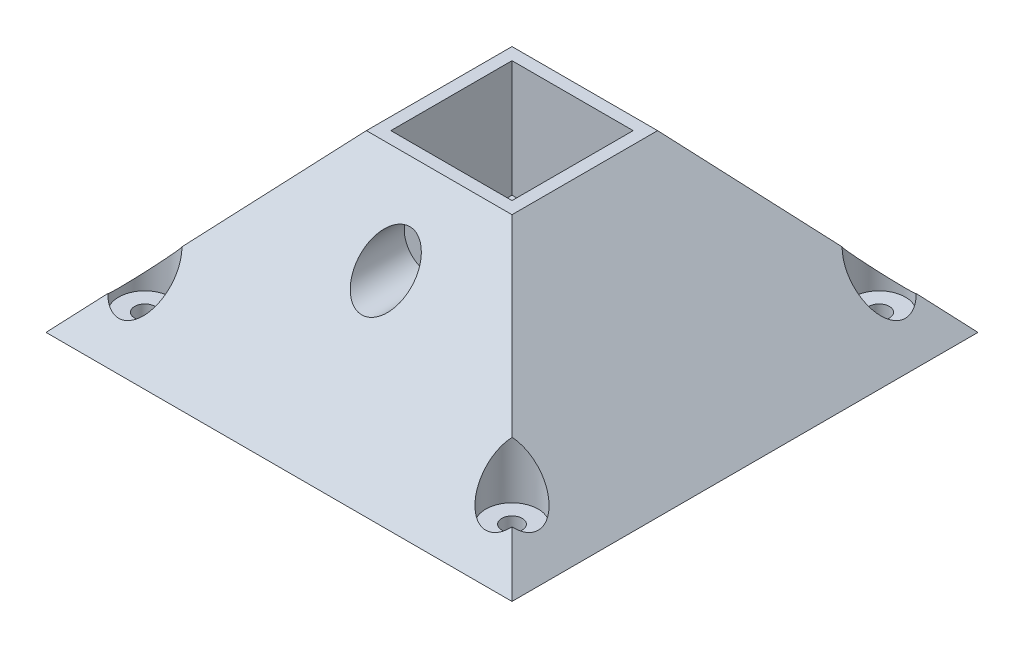
ISO-10303-21;
HEADER;
FILE_DESCRIPTION(('STEP AP214'),'2;1');
FILE_NAME('part.step','',(''),(''),'','','');
FILE_SCHEMA(('AUTOMOTIVE_DESIGN { 1 0 10303 214 1 1 1 1 }'));
ENDSEC;
DATA;
#1=APPLICATION_CONTEXT('core data for automotive mechanical design processes');
#2=APPLICATION_PROTOCOL_DEFINITION('international standard','automotive_design',2000,#1);
#3=PRODUCT_CONTEXT('',#1,'mechanical');
#4=PRODUCT('Part','Part','',(#3));
#5=PRODUCT_RELATED_PRODUCT_CATEGORY('part','',(#4));
#6=PRODUCT_DEFINITION_FORMATION('','',#4);
#7=PRODUCT_DEFINITION_CONTEXT('part definition',#1,'design');
#8=PRODUCT_DEFINITION('design','',#6,#7);
#9=PRODUCT_DEFINITION_SHAPE('','',#8);
#10=(LENGTH_UNIT() NAMED_UNIT(*) SI_UNIT(.MILLI.,.METRE.));
#11=(NAMED_UNIT(*) PLANE_ANGLE_UNIT() SI_UNIT($,.RADIAN.));
#12=(NAMED_UNIT(*) SI_UNIT($,.STERADIAN.) SOLID_ANGLE_UNIT());
#13=UNCERTAINTY_MEASURE_WITH_UNIT(LENGTH_MEASURE(1.E-05),#10,'distance_accuracy_value','');
#14=(GEOMETRIC_REPRESENTATION_CONTEXT(3) GLOBAL_UNCERTAINTY_ASSIGNED_CONTEXT((#13)) GLOBAL_UNIT_ASSIGNED_CONTEXT((#10,
#11,#12)) REPRESENTATION_CONTEXT('',''));
#15=CARTESIAN_POINT('',(0.,0.,0.));
#16=DIRECTION('',(0.,0.,1.));
#17=DIRECTION('',(1.,0.,0.));
#18=AXIS2_PLACEMENT_3D('',#15,#16,#17);
#19=CARTESIAN_POINT('',(31.5147186257611,30.0001,-31.5147186257618));
#20=DIRECTION('',(0.,-1.,0.));
#21=DIRECTION('',(0.,0.,-1.));
#22=AXIS2_PLACEMENT_3D('',#19,#20,#21);
#23=CYLINDRICAL_SURFACE('',#22,1.75);
#24=CARTESIAN_POINT('',(31.5147186257611,0.,-31.5147186257618));
#25=DIRECTION('',(0.,1.,0.));
#26=DIRECTION('',(-1.,0.,0.));
#27=AXIS2_PLACEMENT_3D('',#24,#25,#26);
#28=CIRCLE('',#27,1.75);
#29=CARTESIAN_POINT('',(29.7647186257611,0.,-31.5147186257617));
#30=VERTEX_POINT('',#29);
#31=EDGE_CURVE('E691',#30,#30,#28,.T.);
#32=ORIENTED_EDGE('',*,*,#31,.F.);
#33=EDGE_LOOP('',(#32));
#34=FACE_BOUND('',#33,.T.);
#35=CARTESIAN_POINT('',(31.5147186257611,3.,-31.5147186257618));
#36=DIRECTION('',(0.,1.,0.));
#37=DIRECTION('',(-1.,0.,0.));
#38=AXIS2_PLACEMENT_3D('',#35,#36,#37);
#39=CIRCLE('',#38,1.75);
#40=CARTESIAN_POINT('',(29.7647186257611,3.,-31.5147186257617));
#41=VERTEX_POINT('',#40);
#42=EDGE_CURVE('E680',#41,#41,#39,.T.);
#43=ORIENTED_EDGE('',*,*,#42,.T.);
#44=EDGE_LOOP('',(#43));
#45=FACE_BOUND('',#44,.T.);
#46=ADVANCED_FACE('F46',(#34,#45),#23,.F.);
#47=CARTESIAN_POINT('',(31.5147186257614,30.0001,31.5147186257614));
#48=DIRECTION('',(0.,-1.,0.));
#49=DIRECTION('',(0.,0.,-1.));
#50=AXIS2_PLACEMENT_3D('',#47,#48,#49);
#51=CYLINDRICAL_SURFACE('',#50,1.75);
#52=CARTESIAN_POINT('',(31.5147186257614,0.,31.5147186257614));
#53=DIRECTION('',(0.,1.,0.));
#54=DIRECTION('',(0.,0.,-1.));
#55=AXIS2_PLACEMENT_3D('',#52,#53,#54);
#56=CIRCLE('',#55,1.75);
#57=CARTESIAN_POINT('',(31.5147186257614,0.,29.7647186257614));
#58=VERTEX_POINT('',#57);
#59=EDGE_CURVE('E695',#58,#58,#56,.T.);
#60=ORIENTED_EDGE('',*,*,#59,.F.);
#61=EDGE_LOOP('',(#60));
#62=FACE_BOUND('',#61,.T.);
#63=CARTESIAN_POINT('',(31.5147186257614,3.,31.5147186257614));
#64=DIRECTION('',(0.,1.,0.));
#65=DIRECTION('',(0.,0.,-1.));
#66=AXIS2_PLACEMENT_3D('',#63,#64,#65);
#67=CIRCLE('',#66,1.75);
#68=CARTESIAN_POINT('',(31.5147186257614,3.,29.7647186257614));
#69=VERTEX_POINT('',#68);
#70=EDGE_CURVE('E672',#69,#69,#67,.T.);
#71=ORIENTED_EDGE('',*,*,#70,.T.);
#72=EDGE_LOOP('',(#71));
#73=FACE_BOUND('',#72,.T.);
#74=ADVANCED_FACE('F497',(#62,#73),#51,.F.);
#75=CARTESIAN_POINT('',(-31.5147186257613,30.0001,31.5147186257615));
#76=DIRECTION('',(0.,-1.,0.));
#77=DIRECTION('',(0.,0.,-1.));
#78=AXIS2_PLACEMENT_3D('',#75,#76,#77);
#79=CYLINDRICAL_SURFACE('',#78,1.75);
#80=CARTESIAN_POINT('',(-31.5147186257613,0.,31.5147186257615));
#81=DIRECTION('',(0.,1.,0.));
#82=DIRECTION('',(1.,0.,0.));
#83=AXIS2_PLACEMENT_3D('',#80,#81,#82);
#84=CIRCLE('',#83,1.75);
#85=CARTESIAN_POINT('',(-29.7647186257613,0.,31.5147186257615));
#86=VERTEX_POINT('',#85);
#87=EDGE_CURVE('E692',#86,#86,#84,.T.);
#88=ORIENTED_EDGE('',*,*,#87,.F.);
#89=EDGE_LOOP('',(#88));
#90=FACE_BOUND('',#89,.T.);
#91=CARTESIAN_POINT('',(-31.5147186257613,3.,31.5147186257615));
#92=DIRECTION('',(0.,1.,0.));
#93=DIRECTION('',(1.,0.,0.));
#94=AXIS2_PLACEMENT_3D('',#91,#92,#93);
#95=CIRCLE('',#94,1.75);
#96=CARTESIAN_POINT('',(-29.7647186257613,3.,31.5147186257615));
#97=VERTEX_POINT('',#96);
#98=EDGE_CURVE('E662',#97,#97,#95,.T.);
#99=ORIENTED_EDGE('',*,*,#98,.T.);
#100=EDGE_LOOP('',(#99));
#101=FACE_BOUND('',#100,.T.);
#102=ADVANCED_FACE('F504',(#90,#101),#79,.F.);
#103=CARTESIAN_POINT('',(-31.5147186257614,30.0001,-31.5147186257614));
#104=DIRECTION('',(0.,-1.,0.));
#105=DIRECTION('',(0.,0.,-1.));
#106=AXIS2_PLACEMENT_3D('',#103,#104,#105);
#107=CYLINDRICAL_SURFACE('',#106,1.75);
#108=CARTESIAN_POINT('',(-31.5147186257614,0.,-31.5147186257614));
#109=DIRECTION('',(0.,1.,0.));
#110=DIRECTION('',(0.,0.,1.));
#111=AXIS2_PLACEMENT_3D('',#108,#109,#110);
#112=CIRCLE('',#111,1.75);
#113=CARTESIAN_POINT('',(-31.5147186257614,0.,-29.7647186257614));
#114=VERTEX_POINT('',#113);
#115=EDGE_CURVE('E387',#114,#114,#112,.T.);
#116=ORIENTED_EDGE('',*,*,#115,.F.);
#117=EDGE_LOOP('',(#116));
#118=FACE_BOUND('',#117,.T.);
#119=CARTESIAN_POINT('',(-31.5147186257614,3.,-31.5147186257614));
#120=DIRECTION('',(0.,1.,0.));
#121=DIRECTION('',(0.,0.,1.));
#122=AXIS2_PLACEMENT_3D('',#119,#120,#121);
#123=CIRCLE('',#122,1.75);
#124=CARTESIAN_POINT('',(-31.5147186257614,3.,-29.7647186257614));
#125=VERTEX_POINT('',#124);
#126=EDGE_CURVE('E396',#125,#125,#123,.T.);
#127=ORIENTED_EDGE('',*,*,#126,.T.);
#128=EDGE_LOOP('',(#127));
#129=FACE_BOUND('',#128,.T.);
#130=ADVANCED_FACE('F491',(#118,#129),#107,.F.);
#131=CARTESIAN_POINT('',(0.,20.,40.0001));
#132=DIRECTION('',(0.,0.,-1.));
#133=DIRECTION('',(-1.,0.,0.));
#134=AXIS2_PLACEMENT_3D('',#131,#132,#133);
#135=CYLINDRICAL_SURFACE('',#134,1.75);
#136=CARTESIAN_POINT('',(0.,20.,10.4));
#137=DIRECTION('',(0.,0.,1.));
#138=DIRECTION('',(1.,0.,0.));
#139=AXIS2_PLACEMENT_3D('',#136,#137,#138);
#140=CIRCLE('',#139,1.75);
#141=CARTESIAN_POINT('',(1.75,20.,10.4));
#142=VERTEX_POINT('',#141);
#143=EDGE_CURVE('E314',#142,#142,#140,.F.);
#144=ORIENTED_EDGE('',*,*,#143,.T.);
#145=EDGE_LOOP('',(#144));
#146=FACE_BOUND('',#145,.T.);
#147=CARTESIAN_POINT('',(0.,20.,14.));
#148=DIRECTION('',(0.,0.,1.));
#149=DIRECTION('',(1.,0.,0.));
#150=AXIS2_PLACEMENT_3D('',#147,#148,#149);
#151=CIRCLE('',#150,1.75);
#152=CARTESIAN_POINT('',(1.75,20.,14.));
#153=VERTEX_POINT('',#152);
#154=EDGE_CURVE('E393',#153,#153,#151,.T.);
#155=ORIENTED_EDGE('',*,*,#154,.T.);
#156=EDGE_LOOP('',(#155));
#157=FACE_BOUND('',#156,.T.);
#158=ADVANCED_FACE('F484',(#146,#157),#135,.F.);
#159=CARTESIAN_POINT('',(0.,0.,0.));
#160=DIRECTION('',(0.,1.,0.));
#161=DIRECTION('',(0.,0.,1.));
#162=AXIS2_PLACEMENT_3D('',#159,#160,#161);
#163=PLANE('',#162);
#164=ORIENTED_EDGE('',*,*,#87,.T.);
#165=EDGE_LOOP('',(#164));
#166=FACE_BOUND('',#165,.T.);
#167=ORIENTED_EDGE('',*,*,#59,.T.);
#168=EDGE_LOOP('',(#167));
#169=FACE_BOUND('',#168,.T.);
#170=ORIENTED_EDGE('',*,*,#31,.T.);
#171=EDGE_LOOP('',(#170));
#172=FACE_BOUND('',#171,.T.);
#173=ORIENTED_EDGE('',*,*,#115,.T.);
#174=EDGE_LOOP('',(#173));
#175=FACE_BOUND('',#174,.T.);
#176=DIRECTION('',(0.,0.,1.));
#177=VECTOR('',#176,1.);
#178=CARTESIAN_POINT('',(-40.,0.,40.));
#179=LINE('',#178,#177);
#180=CARTESIAN_POINT('',(-40.,0.,-40.));
#181=VERTEX_POINT('',#180);
#182=CARTESIAN_POINT('',(-40.,0.,40.));
#183=VERTEX_POINT('',#182);
#184=EDGE_CURVE('E305',#181,#183,#179,.T.);
#185=ORIENTED_EDGE('',*,*,#184,.F.);
#186=DIRECTION('',(-1.,0.,0.));
#187=VECTOR('',#186,1.);
#188=CARTESIAN_POINT('',(40.,0.,-40.));
#189=LINE('',#188,#187);
#190=CARTESIAN_POINT('',(40.,0.,-40.));
#191=VERTEX_POINT('',#190);
#192=EDGE_CURVE('E298',#191,#181,#189,.T.);
#193=ORIENTED_EDGE('',*,*,#192,.F.);
#194=DIRECTION('',(0.,0.,-1.));
#195=VECTOR('',#194,1.);
#196=CARTESIAN_POINT('',(40.,0.,40.));
#197=LINE('',#196,#195);
#198=CARTESIAN_POINT('',(40.,0.,40.));
#199=VERTEX_POINT('',#198);
#200=EDGE_CURVE('E157',#199,#191,#197,.T.);
#201=ORIENTED_EDGE('',*,*,#200,.F.);
#202=DIRECTION('',(1.,0.,0.));
#203=VECTOR('',#202,1.);
#204=CARTESIAN_POINT('',(40.,0.,40.));
#205=LINE('',#204,#203);
#206=EDGE_CURVE('E279',#183,#199,#205,.T.);
#207=ORIENTED_EDGE('',*,*,#206,.F.);
#208=EDGE_LOOP('',(#185,#193,#201,#207));
#209=FACE_BOUND('',#208,.T.);
#210=ADVANCED_FACE('F48',(#166,#169,#172,#175,#209),#163,.F.);
#211=CARTESIAN_POINT('',(0.,30.,0.));
#212=DIRECTION('',(0.,1.,0.));
#213=DIRECTION('',(0.,0.,1.));
#214=AXIS2_PLACEMENT_3D('',#211,#212,#213);
#215=PLANE('',#214);
#216=DIRECTION('',(0.,0.,1.));
#217=VECTOR('',#216,1.);
#218=CARTESIAN_POINT('',(-10.4,30.,10.4));
#219=LINE('',#218,#217);
#220=CARTESIAN_POINT('',(-10.4,30.,-10.4));
#221=VERTEX_POINT('',#220);
#222=CARTESIAN_POINT('',(-10.4,30.,10.4));
#223=VERTEX_POINT('',#222);
#224=EDGE_CURVE('E323',#221,#223,#219,.T.);
#225=ORIENTED_EDGE('',*,*,#224,.F.);
#226=DIRECTION('',(-1.,0.,0.));
#227=VECTOR('',#226,1.);
#228=CARTESIAN_POINT('',(10.4,30.,-10.4));
#229=LINE('',#228,#227);
#230=CARTESIAN_POINT('',(10.4,30.,-10.4));
#231=VERTEX_POINT('',#230);
#232=EDGE_CURVE('E411',#231,#221,#229,.T.);
#233=ORIENTED_EDGE('',*,*,#232,.F.);
#234=DIRECTION('',(0.,0.,-1.));
#235=VECTOR('',#234,1.);
#236=CARTESIAN_POINT('',(10.4,30.,10.4));
#237=LINE('',#236,#235);
#238=CARTESIAN_POINT('',(10.4,30.,10.4));
#239=VERTEX_POINT('',#238);
#240=EDGE_CURVE('E430',#239,#231,#237,.T.);
#241=ORIENTED_EDGE('',*,*,#240,.F.);
#242=DIRECTION('',(1.,0.,0.));
#243=VECTOR('',#242,1.);
#244=CARTESIAN_POINT('',(10.4,30.,10.4));
#245=LINE('',#244,#243);
#246=EDGE_CURVE('E426',#223,#239,#245,.T.);
#247=ORIENTED_EDGE('',*,*,#246,.F.);
#248=EDGE_LOOP('',(#225,#233,#241,#247));
#249=FACE_BOUND('',#248,.T.);
#250=DIRECTION('',(0.,0.,1.));
#251=VECTOR('',#250,1.);
#252=CARTESIAN_POINT('',(-12.5,30.,12.5));
#253=LINE('',#252,#251);
#254=CARTESIAN_POINT('',(-12.5,30.,-12.5));
#255=VERTEX_POINT('',#254);
#256=CARTESIAN_POINT('',(-12.5,30.,12.5));
#257=VERTEX_POINT('',#256);
#258=EDGE_CURVE('E212',#255,#257,#253,.T.);
#259=ORIENTED_EDGE('',*,*,#258,.T.);
#260=DIRECTION('',(1.,0.,0.));
#261=VECTOR('',#260,1.);
#262=CARTESIAN_POINT('',(12.5,30.,12.5));
#263=LINE('',#262,#261);
#264=CARTESIAN_POINT('',(12.5,30.,12.5));
#265=VERTEX_POINT('',#264);
#266=EDGE_CURVE('E215',#257,#265,#263,.T.);
#267=ORIENTED_EDGE('',*,*,#266,.T.);
#268=DIRECTION('',(0.,0.,-1.));
#269=VECTOR('',#268,1.);
#270=CARTESIAN_POINT('',(12.5,30.,12.5));
#271=LINE('',#270,#269);
#272=CARTESIAN_POINT('',(12.5,30.,-12.5));
#273=VERTEX_POINT('',#272);
#274=EDGE_CURVE('E181',#265,#273,#271,.T.);
#275=ORIENTED_EDGE('',*,*,#274,.T.);
#276=DIRECTION('',(-1.,0.,0.));
#277=VECTOR('',#276,1.);
#278=CARTESIAN_POINT('',(12.5,30.,-12.5));
#279=LINE('',#278,#277);
#280=EDGE_CURVE('E256',#273,#255,#279,.T.);
#281=ORIENTED_EDGE('',*,*,#280,.T.);
#282=EDGE_LOOP('',(#259,#267,#275,#281));
#283=FACE_BOUND('',#282,.T.);
#284=ADVANCED_FACE('F230',(#249,#283),#215,.T.);
#285=CARTESIAN_POINT('',(-21.7358490566038,19.9245283018868,0.));
#286=DIRECTION('',(-0.737154140200741,0.675724628517346,0.));
#287=DIRECTION('',(-0.675724628517346,-0.737154140200741,0.));
#288=AXIS2_PLACEMENT_3D('',#285,#286,#287);
#289=PLANE('',#288);
#290=DIRECTION('',(-0.559885258415216,-0.610783918271145,0.559885258415216));
#291=VECTOR('',#290,1.);
#292=CARTESIAN_POINT('',(-12.5,30.,12.5));
#293=LINE('',#292,#291);
#294=CARTESIAN_POINT('',(-34.6966991411009,5.78541911879903,34.6966991411009));
#295=VERTEX_POINT('',#294);
#296=EDGE_CURVE('E168',#295,#183,#293,.T.);
#297=ORIENTED_EDGE('',*,*,#296,.F.);
#298=CARTESIAN_POINT('',(-31.5147186257613,9.25667059007857,31.5147186257615));
#299=DIRECTION('',(-0.737154140200741,0.675724628517346,0.));
#300=DIRECTION('',(-0.675724628517346,-0.737154140200741,0.));
#301=AXIS2_PLACEMENT_3D('',#298,#299,#300);
#302=ELLIPSE('',#301,6.65951751658625,4.5);
#303=CARTESIAN_POINT('',(-28.332738110422,12.7279220613579,28.332738110422));
#304=VERTEX_POINT('',#303);
#305=EDGE_CURVE('E62',#295,#304,#302,.F.);
#306=ORIENTED_EDGE('',*,*,#305,.T.);
#307=EDGE_CURVE('E161',#257,#304,#293,.T.);
#308=ORIENTED_EDGE('',*,*,#307,.F.);
#309=ORIENTED_EDGE('',*,*,#258,.F.);
#310=DIRECTION('',(-0.559885258415216,-0.610783918271145,-0.559885258415216));
#311=VECTOR('',#310,1.);
#312=CARTESIAN_POINT('',(-12.5,30.,-12.5));
#313=LINE('',#312,#311);
#314=CARTESIAN_POINT('',(-28.332738110422,12.7279220613579,-28.332738110422));
#315=VERTEX_POINT('',#314);
#316=EDGE_CURVE('E331',#255,#315,#313,.T.);
#317=ORIENTED_EDGE('',*,*,#316,.T.);
#318=CARTESIAN_POINT('',(-31.5147186257614,9.25667059007844,-31.5147186257614));
#319=DIRECTION('',(-0.737154140200741,0.675724628517346,0.));
#320=DIRECTION('',(-0.675724628517346,-0.737154140200741,0.));
#321=AXIS2_PLACEMENT_3D('',#318,#319,#320);
#322=ELLIPSE('',#321,6.65951751658625,4.5);
#323=CARTESIAN_POINT('',(-34.6966991411009,5.78541911879903,-34.6966991411009));
#324=VERTEX_POINT('',#323);
#325=EDGE_CURVE('E385',#315,#324,#322,.F.);
#326=ORIENTED_EDGE('',*,*,#325,.T.);
#327=EDGE_CURVE('E219',#324,#181,#313,.T.);
#328=ORIENTED_EDGE('',*,*,#327,.T.);
#329=ORIENTED_EDGE('',*,*,#184,.T.);
#330=EDGE_LOOP('',(#297,#306,#308,#309,#317,#326,#328,#329));
#331=FACE_BOUND('',#330,.T.);
#332=ADVANCED_FACE('F240',(#331),#289,.T.);
#333=CARTESIAN_POINT('',(0.,19.9245283018868,21.7358490566038));
#334=DIRECTION('',(0.,0.675724628517346,0.737154140200741));
#335=DIRECTION('',(0.,-0.737154140200741,0.675724628517346));
#336=AXIS2_PLACEMENT_3D('',#333,#334,#335);
#337=PLANE('',#336);
#338=CARTESIAN_POINT('',(0.,20.,21.6666666666667));
#339=DIRECTION('',(0.,0.675724628517346,0.737154140200741));
#340=DIRECTION('',(0.,0.737154140200741,-0.675724628517346));
#341=AXIS2_PLACEMENT_3D('',#338,#339,#340);
#342=ELLIPSE('',#341,6.10455772353739,4.5);
#343=CARTESIAN_POINT('',(0.,24.5,17.5416666666667));
#344=VERTEX_POINT('',#343);
#345=EDGE_CURVE('E324',#344,#344,#342,.F.);
#346=ORIENTED_EDGE('',*,*,#345,.T.);
#347=EDGE_LOOP('',(#346));
#348=FACE_BOUND('',#347,.T.);
#349=ORIENTED_EDGE('',*,*,#307,.T.);
#350=CARTESIAN_POINT('',(-31.5147186257613,9.25667059007832,31.5147186257615));
#351=DIRECTION('',(0.,0.675724628517346,0.737154140200741));
#352=DIRECTION('',(0.,-0.737154140200741,0.675724628517346));
#353=AXIS2_PLACEMENT_3D('',#350,#351,#352);
#354=ELLIPSE('',#353,6.65951751658625,4.5);
#355=EDGE_CURVE('E12',#304,#295,#354,.F.);
#356=ORIENTED_EDGE('',*,*,#355,.T.);
#357=ORIENTED_EDGE('',*,*,#296,.T.);
#358=ORIENTED_EDGE('',*,*,#206,.T.);
#359=DIRECTION('',(0.559885258415216,-0.610783918271145,0.559885258415216));
#360=VECTOR('',#359,1.);
#361=CARTESIAN_POINT('',(12.5,30.,12.5));
#362=LINE('',#361,#360);
#363=CARTESIAN_POINT('',(34.6966991411009,5.78541911879902,34.6966991411009));
#364=VERTEX_POINT('',#363);
#365=EDGE_CURVE('E165',#364,#199,#362,.T.);
#366=ORIENTED_EDGE('',*,*,#365,.F.);
#367=CARTESIAN_POINT('',(31.5147186257614,9.25667059007845,31.5147186257614));
#368=DIRECTION('',(0.,0.675724628517346,0.737154140200741));
#369=DIRECTION('',(0.,-0.737154140200741,0.675724628517346));
#370=AXIS2_PLACEMENT_3D('',#367,#368,#369);
#371=ELLIPSE('',#370,6.65951751658625,4.5);
#372=CARTESIAN_POINT('',(28.332738110422,12.7279220613579,28.332738110422));
#373=VERTEX_POINT('',#372);
#374=EDGE_CURVE('E151',#364,#373,#371,.F.);
#375=ORIENTED_EDGE('',*,*,#374,.T.);
#376=EDGE_CURVE('E363',#265,#373,#362,.T.);
#377=ORIENTED_EDGE('',*,*,#376,.F.);
#378=ORIENTED_EDGE('',*,*,#266,.F.);
#379=EDGE_LOOP('',(#349,#356,#357,#358,#366,#375,#377,#378));
#380=FACE_BOUND('',#379,.T.);
#381=ADVANCED_FACE('F377',(#348,#380),#337,.T.);
#382=CARTESIAN_POINT('',(0.,19.9245283018868,-21.7358490566038));
#383=DIRECTION('',(0.,0.675724628517346,-0.737154140200741));
#384=DIRECTION('',(0.,0.737154140200741,0.675724628517346));
#385=AXIS2_PLACEMENT_3D('',#382,#383,#384);
#386=PLANE('',#385);
#387=DIRECTION('',(0.559885258415216,-0.610783918271145,-0.559885258415216));
#388=VECTOR('',#387,1.);
#389=CARTESIAN_POINT('',(12.5,30.,-12.5));
#390=LINE('',#389,#388);
#391=CARTESIAN_POINT('',(28.332738110422,12.7279220613579,-28.332738110422));
#392=VERTEX_POINT('',#391);
#393=EDGE_CURVE('E149',#273,#392,#390,.T.);
#394=ORIENTED_EDGE('',*,*,#393,.T.);
#395=CARTESIAN_POINT('',(31.5147186257611,9.25667059007809,-31.5147186257618));
#396=DIRECTION('',(0.,0.675724628517346,-0.737154140200741));
#397=DIRECTION('',(0.,-0.737154140200741,-0.675724628517346));
#398=AXIS2_PLACEMENT_3D('',#395,#396,#397);
#399=ELLIPSE('',#398,6.65951751658625,4.5);
#400=CARTESIAN_POINT('',(34.6966991411009,5.78541911879903,-34.6966991411009));
#401=VERTEX_POINT('',#400);
#402=EDGE_CURVE('E68',#392,#401,#399,.F.);
#403=ORIENTED_EDGE('',*,*,#402,.T.);
#404=EDGE_CURVE('E146',#401,#191,#390,.T.);
#405=ORIENTED_EDGE('',*,*,#404,.T.);
#406=ORIENTED_EDGE('',*,*,#192,.T.);
#407=ORIENTED_EDGE('',*,*,#327,.F.);
#408=CARTESIAN_POINT('',(-31.5147186257614,9.25667059007846,-31.5147186257614));
#409=DIRECTION('',(0.,0.675724628517346,-0.737154140200741));
#410=DIRECTION('',(0.,-0.737154140200741,-0.675724628517346));
#411=AXIS2_PLACEMENT_3D('',#408,#409,#410);
#412=ELLIPSE('',#411,6.65951751658625,4.5);
#413=EDGE_CURVE('E141',#324,#315,#412,.F.);
#414=ORIENTED_EDGE('',*,*,#413,.T.);
#415=ORIENTED_EDGE('',*,*,#316,.F.);
#416=ORIENTED_EDGE('',*,*,#280,.F.);
#417=EDGE_LOOP('',(#394,#403,#405,#406,#407,#414,#415,#416));
#418=FACE_BOUND('',#417,.T.);
#419=ADVANCED_FACE('F144',(#418),#386,.T.);
#420=CARTESIAN_POINT('',(21.7358490566038,19.9245283018868,0.));
#421=DIRECTION('',(0.737154140200741,0.675724628517346,0.));
#422=DIRECTION('',(-0.675724628517346,0.737154140200741,0.));
#423=AXIS2_PLACEMENT_3D('',#420,#421,#422);
#424=PLANE('',#423);
#425=ORIENTED_EDGE('',*,*,#376,.T.);
#426=CARTESIAN_POINT('',(31.5147186257614,9.25667059007844,31.5147186257614));
#427=DIRECTION('',(0.737154140200741,0.675724628517346,0.));
#428=DIRECTION('',(0.675724628517346,-0.737154140200741,0.));
#429=AXIS2_PLACEMENT_3D('',#426,#427,#428);
#430=ELLIPSE('',#429,6.65951751658625,4.5);
#431=EDGE_CURVE('E56',#373,#364,#430,.F.);
#432=ORIENTED_EDGE('',*,*,#431,.T.);
#433=ORIENTED_EDGE('',*,*,#365,.T.);
#434=ORIENTED_EDGE('',*,*,#200,.T.);
#435=ORIENTED_EDGE('',*,*,#404,.F.);
#436=CARTESIAN_POINT('',(31.5147186257611,9.2566705900788,-31.5147186257618));
#437=DIRECTION('',(0.737154140200741,0.675724628517346,0.));
#438=DIRECTION('',(0.675724628517346,-0.737154140200741,0.));
#439=AXIS2_PLACEMENT_3D('',#436,#437,#438);
#440=ELLIPSE('',#439,6.65951751658625,4.5);
#441=EDGE_CURVE('E133',#401,#392,#440,.F.);
#442=ORIENTED_EDGE('',*,*,#441,.T.);
#443=ORIENTED_EDGE('',*,*,#393,.F.);
#444=ORIENTED_EDGE('',*,*,#274,.F.);
#445=EDGE_LOOP('',(#425,#432,#433,#434,#435,#442,#443,#444));
#446=FACE_BOUND('',#445,.T.);
#447=ADVANCED_FACE('F155',(#446),#424,.T.);
#448=CARTESIAN_POINT('',(-10.4,10.,10.4));
#449=DIRECTION('',(-1.,0.,0.));
#450=DIRECTION('',(0.,0.,1.));
#451=AXIS2_PLACEMENT_3D('',#448,#449,#450);
#452=PLANE('',#451);
#453=ORIENTED_EDGE('',*,*,#224,.T.);
#454=DIRECTION('',(0.,1.,0.));
#455=VECTOR('',#454,1.);
#456=CARTESIAN_POINT('',(-10.4,10.,10.4));
#457=LINE('',#456,#455);
#458=CARTESIAN_POINT('',(-10.4,10.,10.4));
#459=VERTEX_POINT('',#458);
#460=EDGE_CURVE('E423',#459,#223,#457,.T.);
#461=ORIENTED_EDGE('',*,*,#460,.F.);
#462=DIRECTION('',(0.,0.,1.));
#463=VECTOR('',#462,1.);
#464=CARTESIAN_POINT('',(-10.4,10.,10.4));
#465=LINE('',#464,#463);
#466=CARTESIAN_POINT('',(-10.4,10.,-10.4));
#467=VERTEX_POINT('',#466);
#468=EDGE_CURVE('E406',#467,#459,#465,.T.);
#469=ORIENTED_EDGE('',*,*,#468,.F.);
#470=DIRECTION('',(0.,1.,0.));
#471=VECTOR('',#470,1.);
#472=CARTESIAN_POINT('',(-10.4,10.,-10.4));
#473=LINE('',#472,#471);
#474=EDGE_CURVE('E353',#467,#221,#473,.T.);
#475=ORIENTED_EDGE('',*,*,#474,.T.);
#476=EDGE_LOOP('',(#453,#461,#469,#475));
#477=FACE_BOUND('',#476,.T.);
#478=ADVANCED_FACE('F196',(#477),#452,.F.);
#479=CARTESIAN_POINT('',(10.4,10.,-10.4));
#480=DIRECTION('',(0.,0.,-1.));
#481=DIRECTION('',(-1.,0.,0.));
#482=AXIS2_PLACEMENT_3D('',#479,#480,#481);
#483=PLANE('',#482);
#484=ORIENTED_EDGE('',*,*,#232,.T.);
#485=ORIENTED_EDGE('',*,*,#474,.F.);
#486=DIRECTION('',(-1.,0.,0.));
#487=VECTOR('',#486,1.);
#488=CARTESIAN_POINT('',(10.4,10.,-10.4));
#489=LINE('',#488,#487);
#490=CARTESIAN_POINT('',(10.4,10.,-10.4));
#491=VERTEX_POINT('',#490);
#492=EDGE_CURVE('E419',#491,#467,#489,.T.);
#493=ORIENTED_EDGE('',*,*,#492,.F.);
#494=DIRECTION('',(0.,1.,0.));
#495=VECTOR('',#494,1.);
#496=CARTESIAN_POINT('',(10.4,10.,-10.4));
#497=LINE('',#496,#495);
#498=EDGE_CURVE('E439',#491,#231,#497,.T.);
#499=ORIENTED_EDGE('',*,*,#498,.T.);
#500=EDGE_LOOP('',(#484,#485,#493,#499));
#501=FACE_BOUND('',#500,.T.);
#502=ADVANCED_FACE('F534',(#501),#483,.F.);
#503=CARTESIAN_POINT('',(10.4,10.,10.4));
#504=DIRECTION('',(1.,0.,0.));
#505=DIRECTION('',(0.,0.,-1.));
#506=AXIS2_PLACEMENT_3D('',#503,#504,#505);
#507=PLANE('',#506);
#508=ORIENTED_EDGE('',*,*,#240,.T.);
#509=ORIENTED_EDGE('',*,*,#498,.F.);
#510=DIRECTION('',(0.,0.,-1.));
#511=VECTOR('',#510,1.);
#512=CARTESIAN_POINT('',(10.4,10.,10.4));
#513=LINE('',#512,#511);
#514=CARTESIAN_POINT('',(10.4,10.,10.4));
#515=VERTEX_POINT('',#514);
#516=EDGE_CURVE('E415',#515,#491,#513,.T.);
#517=ORIENTED_EDGE('',*,*,#516,.F.);
#518=DIRECTION('',(0.,1.,0.));
#519=VECTOR('',#518,1.);
#520=CARTESIAN_POINT('',(10.4,10.,10.4));
#521=LINE('',#520,#519);
#522=EDGE_CURVE('E442',#515,#239,#521,.T.);
#523=ORIENTED_EDGE('',*,*,#522,.T.);
#524=EDGE_LOOP('',(#508,#509,#517,#523));
#525=FACE_BOUND('',#524,.T.);
#526=ADVANCED_FACE('F537',(#525),#507,.F.);
#527=CARTESIAN_POINT('',(10.4,10.,10.4));
#528=DIRECTION('',(0.,0.,1.));
#529=DIRECTION('',(1.,0.,0.));
#530=AXIS2_PLACEMENT_3D('',#527,#528,#529);
#531=PLANE('',#530);
#532=ORIENTED_EDGE('',*,*,#143,.F.);
#533=EDGE_LOOP('',(#532));
#534=FACE_BOUND('',#533,.T.);
#535=ORIENTED_EDGE('',*,*,#246,.T.);
#536=ORIENTED_EDGE('',*,*,#522,.F.);
#537=DIRECTION('',(1.,0.,0.));
#538=VECTOR('',#537,1.);
#539=CARTESIAN_POINT('',(10.4,10.,10.4));
#540=LINE('',#539,#538);
#541=EDGE_CURVE('E410',#459,#515,#540,.T.);
#542=ORIENTED_EDGE('',*,*,#541,.F.);
#543=ORIENTED_EDGE('',*,*,#460,.T.);
#544=EDGE_LOOP('',(#535,#536,#542,#543));
#545=FACE_BOUND('',#544,.T.);
#546=ADVANCED_FACE('F532',(#534,#545),#531,.F.);
#547=CARTESIAN_POINT('',(0.,10.,0.));
#548=DIRECTION('',(0.,1.,0.));
#549=DIRECTION('',(0.,0.,1.));
#550=AXIS2_PLACEMENT_3D('',#547,#548,#549);
#551=PLANE('',#550);
#552=ORIENTED_EDGE('',*,*,#468,.T.);
#553=ORIENTED_EDGE('',*,*,#541,.T.);
#554=ORIENTED_EDGE('',*,*,#516,.T.);
#555=ORIENTED_EDGE('',*,*,#492,.T.);
#556=EDGE_LOOP('',(#552,#553,#554,#555));
#557=FACE_BOUND('',#556,.T.);
#558=ADVANCED_FACE('F527',(#557),#551,.T.);
#559=CARTESIAN_POINT('',(0.,20.,40.0001));
#560=DIRECTION('',(0.,0.,-1.));
#561=DIRECTION('',(-1.,0.,0.));
#562=AXIS2_PLACEMENT_3D('',#559,#560,#561);
#563=CYLINDRICAL_SURFACE('',#562,4.5);
#564=ORIENTED_EDGE('',*,*,#345,.F.);
#565=EDGE_LOOP('',(#564));
#566=FACE_BOUND('',#565,.T.);
#567=CARTESIAN_POINT('',(0.,20.,14.));
#568=DIRECTION('',(0.,0.,1.));
#569=DIRECTION('',(1.,0.,0.));
#570=AXIS2_PLACEMENT_3D('',#567,#568,#569);
#571=CIRCLE('',#570,4.5);
#572=CARTESIAN_POINT('',(4.5,20.,14.));
#573=VERTEX_POINT('',#572);
#574=EDGE_CURVE('E328',#573,#573,#571,.T.);
#575=ORIENTED_EDGE('',*,*,#574,.F.);
#576=EDGE_LOOP('',(#575));
#577=FACE_BOUND('',#576,.T.);
#578=ADVANCED_FACE('F524',(#566,#577),#563,.F.);
#579=CARTESIAN_POINT('',(0.,0.,14.));
#580=DIRECTION('',(0.,0.,1.));
#581=DIRECTION('',(1.,0.,0.));
#582=AXIS2_PLACEMENT_3D('',#579,#580,#581);
#583=PLANE('',#582);
#584=ORIENTED_EDGE('',*,*,#154,.F.);
#585=EDGE_LOOP('',(#584));
#586=FACE_BOUND('',#585,.T.);
#587=ORIENTED_EDGE('',*,*,#574,.T.);
#588=EDGE_LOOP('',(#587));
#589=FACE_BOUND('',#588,.T.);
#590=ADVANCED_FACE('F518',(#586,#589),#583,.T.);
#591=CARTESIAN_POINT('',(-31.5147186257614,30.0001,-31.5147186257614));
#592=DIRECTION('',(0.,-1.,0.));
#593=DIRECTION('',(0.,0.,-1.));
#594=AXIS2_PLACEMENT_3D('',#591,#592,#593);
#595=CYLINDRICAL_SURFACE('',#594,4.5);
#596=ORIENTED_EDGE('',*,*,#413,.F.);
#597=ORIENTED_EDGE('',*,*,#325,.F.);
#598=EDGE_LOOP('',(#596,#597));
#599=FACE_BOUND('',#598,.T.);
#600=CARTESIAN_POINT('',(-31.5147186257614,3.,-31.5147186257614));
#601=DIRECTION('',(0.,1.,0.));
#602=DIRECTION('',(0.,0.,1.));
#603=AXIS2_PLACEMENT_3D('',#600,#601,#602);
#604=CIRCLE('',#603,4.5);
#605=CARTESIAN_POINT('',(-31.5147186257614,3.,-27.0147186257614));
#606=VERTEX_POINT('',#605);
#607=EDGE_CURVE('E388',#606,#606,#604,.T.);
#608=ORIENTED_EDGE('',*,*,#607,.F.);
#609=EDGE_LOOP('',(#608));
#610=FACE_BOUND('',#609,.T.);
#611=ADVANCED_FACE('F383',(#599,#610),#595,.F.);
#612=CARTESIAN_POINT('',(0.,3.,0.));
#613=DIRECTION('',(0.,1.,0.));
#614=DIRECTION('',(0.,0.,1.));
#615=AXIS2_PLACEMENT_3D('',#612,#613,#614);
#616=PLANE('',#615);
#617=ORIENTED_EDGE('',*,*,#126,.F.);
#618=EDGE_LOOP('',(#617));
#619=FACE_BOUND('',#618,.T.);
#620=ORIENTED_EDGE('',*,*,#607,.T.);
#621=EDGE_LOOP('',(#620));
#622=FACE_BOUND('',#621,.T.);
#623=ADVANCED_FACE('F511',(#619,#622),#616,.T.);
#624=CARTESIAN_POINT('',(-31.5147186257613,30.0001,31.5147186257615));
#625=DIRECTION('',(0.,-1.,0.));
#626=DIRECTION('',(0.,0.,-1.));
#627=AXIS2_PLACEMENT_3D('',#624,#625,#626);
#628=CYLINDRICAL_SURFACE('',#627,4.5);
#629=ORIENTED_EDGE('',*,*,#355,.F.);
#630=ORIENTED_EDGE('',*,*,#305,.F.);
#631=EDGE_LOOP('',(#629,#630));
#632=FACE_BOUND('',#631,.T.);
#633=CARTESIAN_POINT('',(-31.5147186257613,3.,31.5147186257615));
#634=DIRECTION('',(0.,1.,0.));
#635=DIRECTION('',(1.,0.,0.));
#636=AXIS2_PLACEMENT_3D('',#633,#634,#635);
#637=CIRCLE('',#636,4.5);
#638=CARTESIAN_POINT('',(-27.0147186257613,3.,31.5147186257615));
#639=VERTEX_POINT('',#638);
#640=EDGE_CURVE('E152',#639,#639,#637,.T.);
#641=ORIENTED_EDGE('',*,*,#640,.F.);
#642=EDGE_LOOP('',(#641));
#643=FACE_BOUND('',#642,.T.);
#644=ADVANCED_FACE('F514',(#632,#643),#628,.F.);
#645=CARTESIAN_POINT('',(0.,3.,0.));
#646=DIRECTION('',(0.,1.,0.));
#647=DIRECTION('',(1.,0.,0.));
#648=AXIS2_PLACEMENT_3D('',#645,#646,#647);
#649=PLANE('',#648);
#650=ORIENTED_EDGE('',*,*,#98,.F.);
#651=EDGE_LOOP('',(#650));
#652=FACE_BOUND('',#651,.T.);
#653=ORIENTED_EDGE('',*,*,#640,.T.);
#654=EDGE_LOOP('',(#653));
#655=FACE_BOUND('',#654,.T.);
#656=ADVANCED_FACE('F650',(#652,#655),#649,.T.);
#657=CARTESIAN_POINT('',(31.5147186257614,30.0001,31.5147186257614));
#658=DIRECTION('',(0.,-1.,0.));
#659=DIRECTION('',(0.,0.,-1.));
#660=AXIS2_PLACEMENT_3D('',#657,#658,#659);
#661=CYLINDRICAL_SURFACE('',#660,4.5);
#662=ORIENTED_EDGE('',*,*,#431,.F.);
#663=ORIENTED_EDGE('',*,*,#374,.F.);
#664=EDGE_LOOP('',(#662,#663));
#665=FACE_BOUND('',#664,.T.);
#666=CARTESIAN_POINT('',(31.5147186257614,3.,31.5147186257614));
#667=DIRECTION('',(0.,1.,0.));
#668=DIRECTION('',(0.,0.,-1.));
#669=AXIS2_PLACEMENT_3D('',#666,#667,#668);
#670=CIRCLE('',#669,4.5);
#671=CARTESIAN_POINT('',(31.5147186257614,3.,27.0147186257614));
#672=VERTEX_POINT('',#671);
#673=EDGE_CURVE('E669',#672,#672,#670,.T.);
#674=ORIENTED_EDGE('',*,*,#673,.F.);
#675=EDGE_LOOP('',(#674));
#676=FACE_BOUND('',#675,.T.);
#677=ADVANCED_FACE('F647',(#665,#676),#661,.F.);
#678=CARTESIAN_POINT('',(0.,3.,0.));
#679=DIRECTION('',(0.,1.,0.));
#680=DIRECTION('',(0.,0.,-1.));
#681=AXIS2_PLACEMENT_3D('',#678,#679,#680);
#682=PLANE('',#681);
#683=ORIENTED_EDGE('',*,*,#70,.F.);
#684=EDGE_LOOP('',(#683));
#685=FACE_BOUND('',#684,.T.);
#686=ORIENTED_EDGE('',*,*,#673,.T.);
#687=EDGE_LOOP('',(#686));
#688=FACE_BOUND('',#687,.T.);
#689=ADVANCED_FACE('F643',(#685,#688),#682,.T.);
#690=CARTESIAN_POINT('',(31.5147186257611,30.0001,-31.5147186257618));
#691=DIRECTION('',(0.,-1.,0.));
#692=DIRECTION('',(0.,0.,-1.));
#693=AXIS2_PLACEMENT_3D('',#690,#691,#692);
#694=CYLINDRICAL_SURFACE('',#693,4.5);
#695=ORIENTED_EDGE('',*,*,#441,.F.);
#696=ORIENTED_EDGE('',*,*,#402,.F.);
#697=EDGE_LOOP('',(#695,#696));
#698=FACE_BOUND('',#697,.T.);
#699=CARTESIAN_POINT('',(31.5147186257611,3.,-31.5147186257618));
#700=DIRECTION('',(0.,1.,0.));
#701=DIRECTION('',(-1.,0.,0.));
#702=AXIS2_PLACEMENT_3D('',#699,#700,#701);
#703=CIRCLE('',#702,4.5);
#704=CARTESIAN_POINT('',(27.0147186257611,3.,-31.5147186257617));
#705=VERTEX_POINT('',#704);
#706=EDGE_CURVE('E676',#705,#705,#703,.T.);
#707=ORIENTED_EDGE('',*,*,#706,.F.);
#708=EDGE_LOOP('',(#707));
#709=FACE_BOUND('',#708,.T.);
#710=ADVANCED_FACE('F134',(#698,#709),#694,.F.);
#711=CARTESIAN_POINT('',(0.,3.,0.));
#712=DIRECTION('',(0.,1.,0.));
#713=DIRECTION('',(-1.,0.,0.));
#714=AXIS2_PLACEMENT_3D('',#711,#712,#713);
#715=PLANE('',#714);
#716=ORIENTED_EDGE('',*,*,#42,.F.);
#717=EDGE_LOOP('',(#716));
#718=FACE_BOUND('',#717,.T.);
#719=ORIENTED_EDGE('',*,*,#706,.T.);
#720=EDGE_LOOP('',(#719));
#721=FACE_BOUND('',#720,.T.);
#722=ADVANCED_FACE('F642',(#718,#721),#715,.T.);
#723=CLOSED_SHELL('',(#46,#74,#102,#130,#158,#210,#284,#332,#381,#419,#447,#478,#502,#526,#546,
#558,#578,#590,#611,#623,#644,#656,#677,#689,#710,#722));
#724=MANIFOLD_SOLID_BREP('B2',#723);
#725=ADVANCED_BREP_SHAPE_REPRESENTATION('',(#18,#724),#14);
#726=SHAPE_DEFINITION_REPRESENTATION(#9,#725);
ENDSEC;
END-ISO-10303-21;
